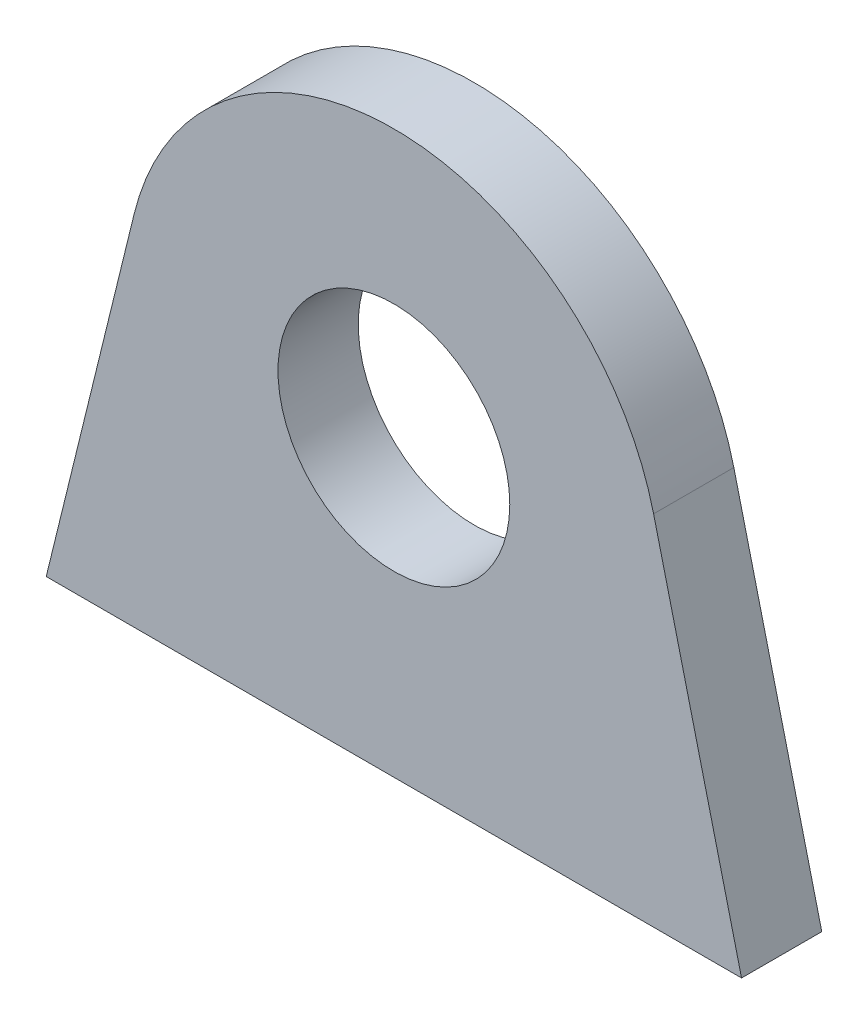
ISO-10303-21;
HEADER;
FILE_DESCRIPTION(('STEP AP214'),'2;1');
FILE_NAME('part.step','',(''),(''),'','','');
FILE_SCHEMA(('AUTOMOTIVE_DESIGN { 1 0 10303 214 1 1 1 1 }'));
ENDSEC;
DATA;
#1=APPLICATION_CONTEXT('core data for automotive mechanical design processes');
#2=APPLICATION_PROTOCOL_DEFINITION('international standard','automotive_design',2000,#1);
#3=PRODUCT_CONTEXT('',#1,'mechanical');
#4=PRODUCT('Part','Part','',(#3));
#5=PRODUCT_RELATED_PRODUCT_CATEGORY('part','',(#4));
#6=PRODUCT_DEFINITION_FORMATION('','',#4);
#7=PRODUCT_DEFINITION_CONTEXT('part definition',#1,'design');
#8=PRODUCT_DEFINITION('design','',#6,#7);
#9=PRODUCT_DEFINITION_SHAPE('','',#8);
#10=(LENGTH_UNIT() NAMED_UNIT(*) SI_UNIT(.MILLI.,.METRE.));
#11=(NAMED_UNIT(*) PLANE_ANGLE_UNIT() SI_UNIT($,.RADIAN.));
#12=(NAMED_UNIT(*) SI_UNIT($,.STERADIAN.) SOLID_ANGLE_UNIT());
#13=UNCERTAINTY_MEASURE_WITH_UNIT(LENGTH_MEASURE(1.E-05),#10,'distance_accuracy_value','');
#14=(GEOMETRIC_REPRESENTATION_CONTEXT(3) GLOBAL_UNCERTAINTY_ASSIGNED_CONTEXT((#13)) GLOBAL_UNIT_ASSIGNED_CONTEXT((#10,
#11,#12)) REPRESENTATION_CONTEXT('',''));
#15=CARTESIAN_POINT('',(0.,0.,0.));
#16=DIRECTION('',(0.,0.,1.));
#17=DIRECTION('',(1.,0.,0.));
#18=AXIS2_PLACEMENT_3D('',#15,#16,#17);
#19=CARTESIAN_POINT('',(0.,0.,9.));
#20=DIRECTION('',(0.,0.,1.));
#21=DIRECTION('',(1.,0.,0.));
#22=AXIS2_PLACEMENT_3D('',#19,#20,#21);
#23=PLANE('',#22);
#24=DIRECTION('',(-0.238595288886803,-0.971119090596526,0.));
#25=VECTOR('',#24,1.);
#26=CARTESIAN_POINT('',(-39.,-33.,9.));
#27=LINE('',#26,#25);
#28=CARTESIAN_POINT('',(-29.1335727178958,7.15785866660408,9.));
#29=VERTEX_POINT('',#28);
#30=CARTESIAN_POINT('',(-39.,-33.,9.));
#31=VERTEX_POINT('',#30);
#32=EDGE_CURVE('E90',#29,#31,#27,.T.);
#33=ORIENTED_EDGE('',*,*,#32,.T.);
#34=DIRECTION('',(1.,0.,0.));
#35=VECTOR('',#34,1.);
#36=CARTESIAN_POINT('',(-39.,-33.,9.));
#37=LINE('',#36,#35);
#38=CARTESIAN_POINT('',(39.,-33.,9.));
#39=VERTEX_POINT('',#38);
#40=EDGE_CURVE('E85',#31,#39,#37,.T.);
#41=ORIENTED_EDGE('',*,*,#40,.T.);
#42=DIRECTION('',(-0.238595288886803,0.971119090596526,0.));
#43=VECTOR('',#42,1.);
#44=CARTESIAN_POINT('',(39.,-33.,9.));
#45=LINE('',#44,#43);
#46=CARTESIAN_POINT('',(29.1335727178958,7.1578586666041,9.));
#47=VERTEX_POINT('',#46);
#48=EDGE_CURVE('E88',#39,#47,#45,.T.);
#49=ORIENTED_EDGE('',*,*,#48,.T.);
#50=CARTESIAN_POINT('',(0.,0.,9.));
#51=DIRECTION('',(0.,0.,1.));
#52=DIRECTION('',(1.,0.,0.));
#53=AXIS2_PLACEMENT_3D('',#50,#51,#52);
#54=CIRCLE('',#53,30.);
#55=EDGE_CURVE('E55',#47,#29,#54,.T.);
#56=ORIENTED_EDGE('',*,*,#55,.T.);
#57=EDGE_LOOP('',(#33,#41,#49,#56));
#58=FACE_BOUND('',#57,.T.);
#59=CARTESIAN_POINT('',(0.,0.,9.));
#60=DIRECTION('',(0.,0.,1.));
#61=DIRECTION('',(1.,0.,0.));
#62=AXIS2_PLACEMENT_3D('',#59,#60,#61);
#63=CIRCLE('',#62,13.);
#64=CARTESIAN_POINT('',(13.,0.,9.));
#65=VERTEX_POINT('',#64);
#66=EDGE_CURVE('E105',#65,#65,#63,.T.);
#67=ORIENTED_EDGE('',*,*,#66,.F.);
#68=EDGE_LOOP('',(#67));
#69=FACE_BOUND('',#68,.T.);
#70=ADVANCED_FACE('F38',(#58,#69),#23,.T.);
#71=CARTESIAN_POINT('',(0.,0.,0.));
#72=DIRECTION('',(0.,0.,1.));
#73=DIRECTION('',(1.,0.,0.));
#74=AXIS2_PLACEMENT_3D('',#71,#72,#73);
#75=PLANE('',#74);
#76=DIRECTION('',(-0.238595288886803,-0.971119090596526,0.));
#77=VECTOR('',#76,1.);
#78=CARTESIAN_POINT('',(-39.,-33.,0.));
#79=LINE('',#78,#77);
#80=CARTESIAN_POINT('',(-29.1335727178958,7.15785866660408,0.));
#81=VERTEX_POINT('',#80);
#82=CARTESIAN_POINT('',(-39.,-33.,0.));
#83=VERTEX_POINT('',#82);
#84=EDGE_CURVE('E102',#81,#83,#79,.T.);
#85=ORIENTED_EDGE('',*,*,#84,.F.);
#86=CARTESIAN_POINT('',(0.,0.,0.));
#87=DIRECTION('',(0.,0.,1.));
#88=DIRECTION('',(1.,0.,0.));
#89=AXIS2_PLACEMENT_3D('',#86,#87,#88);
#90=CIRCLE('',#89,30.);
#91=CARTESIAN_POINT('',(29.1335727178958,7.1578586666041,0.));
#92=VERTEX_POINT('',#91);
#93=EDGE_CURVE('E78',#92,#81,#90,.T.);
#94=ORIENTED_EDGE('',*,*,#93,.F.);
#95=DIRECTION('',(-0.238595288886803,0.971119090596526,0.));
#96=VECTOR('',#95,1.);
#97=CARTESIAN_POINT('',(39.,-33.,0.));
#98=LINE('',#97,#96);
#99=CARTESIAN_POINT('',(39.,-33.,0.));
#100=VERTEX_POINT('',#99);
#101=EDGE_CURVE('E72',#100,#92,#98,.T.);
#102=ORIENTED_EDGE('',*,*,#101,.F.);
#103=DIRECTION('',(1.,0.,0.));
#104=VECTOR('',#103,1.);
#105=CARTESIAN_POINT('',(-39.,-33.,0.));
#106=LINE('',#105,#104);
#107=EDGE_CURVE('E94',#83,#100,#106,.T.);
#108=ORIENTED_EDGE('',*,*,#107,.F.);
#109=EDGE_LOOP('',(#85,#94,#102,#108));
#110=FACE_BOUND('',#109,.T.);
#111=CARTESIAN_POINT('',(0.,0.,0.));
#112=DIRECTION('',(0.,0.,1.));
#113=DIRECTION('',(1.,0.,0.));
#114=AXIS2_PLACEMENT_3D('',#111,#112,#113);
#115=CIRCLE('',#114,13.);
#116=CARTESIAN_POINT('',(13.,0.,0.));
#117=VERTEX_POINT('',#116);
#118=EDGE_CURVE('E117',#117,#117,#115,.T.);
#119=ORIENTED_EDGE('',*,*,#118,.T.);
#120=EDGE_LOOP('',(#119));
#121=FACE_BOUND('',#120,.T.);
#122=ADVANCED_FACE('F113',(#110,#121),#75,.F.);
#123=CARTESIAN_POINT('',(-39.,-33.,9.));
#124=DIRECTION('',(0.971119090596526,-0.238595288886803,0.));
#125=DIRECTION('',(0.238595288886803,0.971119090596526,0.));
#126=AXIS2_PLACEMENT_3D('',#123,#124,#125);
#127=PLANE('',#126);
#128=ORIENTED_EDGE('',*,*,#84,.T.);
#129=DIRECTION('',(0.,0.,-1.));
#130=VECTOR('',#129,1.);
#131=CARTESIAN_POINT('',(-39.,-33.,9.));
#132=LINE('',#131,#130);
#133=EDGE_CURVE('E11',#31,#83,#132,.T.);
#134=ORIENTED_EDGE('',*,*,#133,.F.);
#135=ORIENTED_EDGE('',*,*,#32,.F.);
#136=DIRECTION('',(0.,0.,-1.));
#137=VECTOR('',#136,1.);
#138=CARTESIAN_POINT('',(-29.1335727178958,7.15785866660408,9.));
#139=LINE('',#138,#137);
#140=EDGE_CURVE('E98',#29,#81,#139,.T.);
#141=ORIENTED_EDGE('',*,*,#140,.T.);
#142=EDGE_LOOP('',(#128,#134,#135,#141));
#143=FACE_BOUND('',#142,.T.);
#144=ADVANCED_FACE('F40',(#143),#127,.F.);
#145=CARTESIAN_POINT('',(-39.,-33.,9.));
#146=DIRECTION('',(0.,1.,0.));
#147=DIRECTION('',(0.,0.,1.));
#148=AXIS2_PLACEMENT_3D('',#145,#146,#147);
#149=PLANE('',#148);
#150=ORIENTED_EDGE('',*,*,#107,.T.);
#151=DIRECTION('',(0.,0.,-1.));
#152=VECTOR('',#151,1.);
#153=CARTESIAN_POINT('',(39.,-33.,9.));
#154=LINE('',#153,#152);
#155=EDGE_CURVE('E47',#39,#100,#154,.T.);
#156=ORIENTED_EDGE('',*,*,#155,.F.);
#157=ORIENTED_EDGE('',*,*,#40,.F.);
#158=ORIENTED_EDGE('',*,*,#133,.T.);
#159=EDGE_LOOP('',(#150,#156,#157,#158));
#160=FACE_BOUND('',#159,.T.);
#161=ADVANCED_FACE('F93',(#160),#149,.F.);
#162=CARTESIAN_POINT('',(39.,-33.,9.));
#163=DIRECTION('',(-0.971119090596526,-0.238595288886803,0.));
#164=DIRECTION('',(0.238595288886803,-0.971119090596526,0.));
#165=AXIS2_PLACEMENT_3D('',#162,#163,#164);
#166=PLANE('',#165);
#167=ORIENTED_EDGE('',*,*,#101,.T.);
#168=DIRECTION('',(0.,0.,-1.));
#169=VECTOR('',#168,1.);
#170=CARTESIAN_POINT('',(29.1335727178958,7.1578586666041,9.));
#171=LINE('',#170,#169);
#172=EDGE_CURVE('E95',#47,#92,#171,.T.);
#173=ORIENTED_EDGE('',*,*,#172,.F.);
#174=ORIENTED_EDGE('',*,*,#48,.F.);
#175=ORIENTED_EDGE('',*,*,#155,.T.);
#176=EDGE_LOOP('',(#167,#173,#174,#175));
#177=FACE_BOUND('',#176,.T.);
#178=ADVANCED_FACE('F96',(#177),#166,.F.);
#179=CARTESIAN_POINT('',(0.,0.,9.));
#180=DIRECTION('',(0.,0.,-1.));
#181=DIRECTION('',(-1.,0.,0.));
#182=AXIS2_PLACEMENT_3D('',#179,#180,#181);
#183=CYLINDRICAL_SURFACE('',#182,30.);
#184=ORIENTED_EDGE('',*,*,#93,.T.);
#185=ORIENTED_EDGE('',*,*,#140,.F.);
#186=ORIENTED_EDGE('',*,*,#55,.F.);
#187=ORIENTED_EDGE('',*,*,#172,.T.);
#188=EDGE_LOOP('',(#184,#185,#186,#187));
#189=FACE_BOUND('',#188,.T.);
#190=ADVANCED_FACE('F110',(#189),#183,.T.);
#191=CARTESIAN_POINT('',(0.,0.,9.));
#192=DIRECTION('',(0.,0.,-1.));
#193=DIRECTION('',(-1.,0.,0.));
#194=AXIS2_PLACEMENT_3D('',#191,#192,#193);
#195=CYLINDRICAL_SURFACE('',#194,13.);
#196=ORIENTED_EDGE('',*,*,#66,.T.);
#197=EDGE_LOOP('',(#196));
#198=FACE_BOUND('',#197,.T.);
#199=ORIENTED_EDGE('',*,*,#118,.F.);
#200=EDGE_LOOP('',(#199));
#201=FACE_BOUND('',#200,.T.);
#202=ADVANCED_FACE('F123',(#198,#201),#195,.F.);
#203=CLOSED_SHELL('',(#70,#122,#144,#161,#178,#190,#202));
#204=MANIFOLD_SOLID_BREP('B2',#203);
#205=ADVANCED_BREP_SHAPE_REPRESENTATION('',(#18,#204),#14);
#206=SHAPE_DEFINITION_REPRESENTATION(#9,#205);
ENDSEC;
END-ISO-10303-21;
